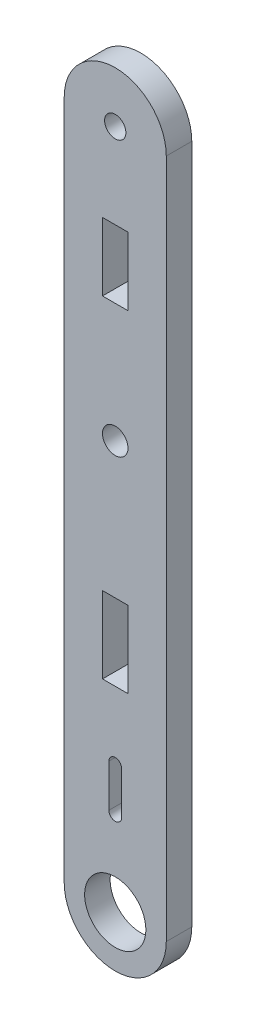
ISO-10303-21;
HEADER;
FILE_DESCRIPTION(('STEP AP214'),'2;1');
FILE_NAME('part.step','',(''),(''),'','','');
FILE_SCHEMA(('AUTOMOTIVE_DESIGN { 1 0 10303 214 1 1 1 1 }'));
ENDSEC;
DATA;
#1=APPLICATION_CONTEXT('core data for automotive mechanical design processes');
#2=APPLICATION_PROTOCOL_DEFINITION('international standard','automotive_design',2000,#1);
#3=PRODUCT_CONTEXT('',#1,'mechanical');
#4=PRODUCT('Part','Part','',(#3));
#5=PRODUCT_RELATED_PRODUCT_CATEGORY('part','',(#4));
#6=PRODUCT_DEFINITION_FORMATION('','',#4);
#7=PRODUCT_DEFINITION_CONTEXT('part definition',#1,'design');
#8=PRODUCT_DEFINITION('design','',#6,#7);
#9=PRODUCT_DEFINITION_SHAPE('','',#8);
#10=(LENGTH_UNIT() NAMED_UNIT(*) SI_UNIT(.MILLI.,.METRE.));
#11=(NAMED_UNIT(*) PLANE_ANGLE_UNIT() SI_UNIT($,.RADIAN.));
#12=(NAMED_UNIT(*) SI_UNIT($,.STERADIAN.) SOLID_ANGLE_UNIT());
#13=UNCERTAINTY_MEASURE_WITH_UNIT(LENGTH_MEASURE(1.E-05),#10,'distance_accuracy_value','');
#14=(GEOMETRIC_REPRESENTATION_CONTEXT(3) GLOBAL_UNCERTAINTY_ASSIGNED_CONTEXT((#13)) GLOBAL_UNIT_ASSIGNED_CONTEXT((#10,
#11,#12)) REPRESENTATION_CONTEXT('',''));
#15=CARTESIAN_POINT('',(0.,0.,0.));
#16=DIRECTION('',(0.,0.,1.));
#17=DIRECTION('',(1.,0.,0.));
#18=AXIS2_PLACEMENT_3D('',#15,#16,#17);
#19=CARTESIAN_POINT('',(6.30029999933328,8.2998760434166,3.));
#20=DIRECTION('',(0.,0.,1.));
#21=DIRECTION('',(1.,0.,0.));
#22=AXIS2_PLACEMENT_3D('',#19,#20,#21);
#23=PLANE('',#22);
#24=CARTESIAN_POINT('',(6.30030000166648,56.2999760424166,3.));
#25=DIRECTION('',(0.,0.,1.));
#26=DIRECTION('',(1.,0.,0.));
#27=AXIS2_PLACEMENT_3D('',#24,#25,#26);
#28=CIRCLE('',#27,1.50000000166676);
#29=CARTESIAN_POINT('',(7.80030000333324,56.2999760424166,3.));
#30=VERTEX_POINT('',#29);
#31=EDGE_CURVE('E219',#30,#30,#28,.T.);
#32=ORIENTED_EDGE('',*,*,#31,.F.);
#33=EDGE_LOOP('',(#32));
#34=FACE_BOUND('',#33,.T.);
#35=CARTESIAN_POINT('',(6.30029999933328,8.2998760434166,3.));
#36=DIRECTION('',(0.,0.,1.));
#37=DIRECTION('',(1.,0.,0.));
#38=AXIS2_PLACEMENT_3D('',#35,#36,#37);
#39=CIRCLE('',#38,5.99999999999991);
#40=CARTESIAN_POINT('',(0.300300000000173,8.29987604406612,3.));
#41=VERTEX_POINT('',#40);
#42=CARTESIAN_POINT('',(12.3003,8.29987604400681,3.));
#43=VERTEX_POINT('',#42);
#44=EDGE_CURVE('E262',#41,#43,#39,.T.);
#45=ORIENTED_EDGE('',*,*,#44,.T.);
#46=DIRECTION('',(0.,1.,0.));
#47=VECTOR('',#46,1.);
#48=CARTESIAN_POINT('',(12.3003,8.29987604400681,3.));
#49=LINE('',#48,#47);
#50=CARTESIAN_POINT('',(12.3003,88.2998760437166,3.));
#51=VERTEX_POINT('',#50);
#52=EDGE_CURVE('E265',#43,#51,#49,.T.);
#53=ORIENTED_EDGE('',*,*,#52,.T.);
#54=CARTESIAN_POINT('',(6.30030000000003,88.2999260438786,3.));
#55=DIRECTION('',(0.,0.,1.));
#56=DIRECTION('',(-1.,0.,0.));
#57=AXIS2_PLACEMENT_3D('',#54,#55,#56);
#58=CIRCLE('',#57,6.00000000020827);
#59=CARTESIAN_POINT('',(0.300300000000128,88.2999760440405,3.));
#60=VERTEX_POINT('',#59);
#61=EDGE_CURVE('E268',#51,#60,#58,.T.);
#62=ORIENTED_EDGE('',*,*,#61,.T.);
#63=DIRECTION('',(0.,-1.,0.));
#64=VECTOR('',#63,1.);
#65=CARTESIAN_POINT('',(0.300300000000128,88.2999760440405,3.));
#66=LINE('',#65,#64);
#67=EDGE_CURVE('E270',#60,#41,#66,.T.);
#68=ORIENTED_EDGE('',*,*,#67,.T.);
#69=EDGE_LOOP('',(#45,#53,#62,#68));
#70=FACE_BOUND('',#69,.T.);
#71=CARTESIAN_POINT('',(6.30029999933328,8.2998760434166,3.));
#72=DIRECTION('',(0.,0.,1.));
#73=DIRECTION('',(1.,0.,0.));
#74=AXIS2_PLACEMENT_3D('',#71,#72,#73);
#75=CIRCLE('',#74,3.6);
#76=CARTESIAN_POINT('',(9.90029999933328,8.2998760434166,3.));
#77=VERTEX_POINT('',#76);
#78=EDGE_CURVE('E256',#77,#77,#75,.T.);
#79=ORIENTED_EDGE('',*,*,#78,.F.);
#80=EDGE_LOOP('',(#79));
#81=FACE_BOUND('',#80,.T.);
#82=DIRECTION('',(0.,1.,0.));
#83=VECTOR('',#82,1.);
#84=CARTESIAN_POINT('',(7.05029999722208,18.29987985471,3.));
#85=LINE('',#84,#83);
#86=CARTESIAN_POINT('',(7.05029999722208,18.29987985471,3.));
#87=VERTEX_POINT('',#86);
#88=CARTESIAN_POINT('',(7.05029999595412,23.299876041305,3.));
#89=VERTEX_POINT('',#88);
#90=EDGE_CURVE('E227',#87,#89,#85,.T.);
#91=ORIENTED_EDGE('',*,*,#90,.F.);
#92=CARTESIAN_POINT('',(6.30030000000001,18.29987985471,3.));
#93=DIRECTION('',(0.,0.,1.));
#94=DIRECTION('',(1.,0.,0.));
#95=AXIS2_PLACEMENT_3D('',#92,#93,#94);
#96=CIRCLE('',#95,0.74999999722207);
#97=CARTESIAN_POINT('',(5.55030000277794,18.29987985471,3.));
#98=VERTEX_POINT('',#97);
#99=EDGE_CURVE('E225',#98,#87,#96,.T.);
#100=ORIENTED_EDGE('',*,*,#99,.F.);
#101=DIRECTION('',(0.,-1.,0.));
#102=VECTOR('',#101,1.);
#103=CARTESIAN_POINT('',(5.55030000277794,18.29987985471,3.));
#104=LINE('',#103,#102);
#105=CARTESIAN_POINT('',(5.55030000277794,23.2998760413049,3.));
#106=VERTEX_POINT('',#105);
#107=EDGE_CURVE('E233',#106,#98,#104,.T.);
#108=ORIENTED_EDGE('',*,*,#107,.F.);
#109=CARTESIAN_POINT('',(6.30029999873205,23.2999177091288,3.));
#110=DIRECTION('',(0.,0.,1.));
#111=DIRECTION('',(1.,0.,0.));
#112=AXIS2_PLACEMENT_3D('',#109,#110,#111);
#113=CIRCLE('',#112,0.749999998379542);
#114=EDGE_CURVE('E230',#89,#106,#113,.T.);
#115=ORIENTED_EDGE('',*,*,#114,.F.);
#116=EDGE_LOOP('',(#91,#100,#108,#115));
#117=FACE_BOUND('',#116,.T.);
#118=CARTESIAN_POINT('',(6.30029999807681,88.2998760421602,3.));
#119=DIRECTION('',(0.,0.,1.));
#120=DIRECTION('',(1.,0.,0.));
#121=AXIS2_PLACEMENT_3D('',#118,#119,#120);
#122=CIRCLE('',#121,1.25);
#123=CARTESIAN_POINT('',(7.55029999807681,88.2998760421602,3.));
#124=VERTEX_POINT('',#123);
#125=EDGE_CURVE('E213',#124,#124,#122,.T.);
#126=ORIENTED_EDGE('',*,*,#125,.F.);
#127=EDGE_LOOP('',(#126));
#128=FACE_BOUND('',#127,.T.);
#129=DIRECTION('',(1.,0.,0.));
#130=VECTOR('',#129,1.);
#131=CARTESIAN_POINT('',(4.8003,70.2998760440833,3.));
#132=LINE('',#131,#130);
#133=CARTESIAN_POINT('',(4.8003,70.2998760440833,3.));
#134=VERTEX_POINT('',#133);
#135=CARTESIAN_POINT('',(7.8003,70.2998760440833,3.));
#136=VERTEX_POINT('',#135);
#137=EDGE_CURVE('E184',#134,#136,#132,.T.);
#138=ORIENTED_EDGE('',*,*,#137,.F.);
#139=DIRECTION('',(0.,-1.,0.));
#140=VECTOR('',#139,1.);
#141=CARTESIAN_POINT('',(4.8003,78.2998760440833,3.));
#142=LINE('',#141,#140);
#143=CARTESIAN_POINT('',(4.8003,78.2998760440833,3.));
#144=VERTEX_POINT('',#143);
#145=EDGE_CURVE('E182',#144,#134,#142,.T.);
#146=ORIENTED_EDGE('',*,*,#145,.F.);
#147=DIRECTION('',(-1.,0.,0.));
#148=VECTOR('',#147,1.);
#149=CARTESIAN_POINT('',(4.8003,78.2998760440833,3.));
#150=LINE('',#149,#148);
#151=CARTESIAN_POINT('',(7.8003,78.2998760440833,3.));
#152=VERTEX_POINT('',#151);
#153=EDGE_CURVE('E190',#152,#144,#150,.T.);
#154=ORIENTED_EDGE('',*,*,#153,.F.);
#155=DIRECTION('',(0.,1.,0.));
#156=VECTOR('',#155,1.);
#157=CARTESIAN_POINT('',(7.8003,78.2998760440833,3.));
#158=LINE('',#157,#156);
#159=EDGE_CURVE('E187',#136,#152,#158,.T.);
#160=ORIENTED_EDGE('',*,*,#159,.F.);
#161=EDGE_LOOP('',(#138,#146,#154,#160));
#162=FACE_BOUND('',#161,.T.);
#163=DIRECTION('',(-1.,0.,0.));
#164=VECTOR('',#163,1.);
#165=CARTESIAN_POINT('',(7.8003,40.2998760440833,3.));
#166=LINE('',#165,#164);
#167=CARTESIAN_POINT('',(7.8003,40.2998760440833,3.));
#168=VERTEX_POINT('',#167);
#169=CARTESIAN_POINT('',(4.8003,40.2998760440833,3.));
#170=VERTEX_POINT('',#169);
#171=EDGE_CURVE('E154',#168,#170,#166,.T.);
#172=ORIENTED_EDGE('',*,*,#171,.F.);
#173=DIRECTION('',(0.,1.,0.));
#174=VECTOR('',#173,1.);
#175=CARTESIAN_POINT('',(7.8003,31.2998760440833,3.));
#176=LINE('',#175,#174);
#177=CARTESIAN_POINT('',(7.8003,31.2998760440833,3.));
#178=VERTEX_POINT('',#177);
#179=EDGE_CURVE('E146',#178,#168,#176,.T.);
#180=ORIENTED_EDGE('',*,*,#179,.F.);
#181=DIRECTION('',(1.,0.,0.));
#182=VECTOR('',#181,1.);
#183=CARTESIAN_POINT('',(7.8003,31.2998760440833,3.));
#184=LINE('',#183,#182);
#185=CARTESIAN_POINT('',(4.8003,31.2998760440833,3.));
#186=VERTEX_POINT('',#185);
#187=EDGE_CURVE('E168',#186,#178,#184,.T.);
#188=ORIENTED_EDGE('',*,*,#187,.F.);
#189=DIRECTION('',(0.,-1.,0.));
#190=VECTOR('',#189,1.);
#191=CARTESIAN_POINT('',(4.8003,31.2998760440833,3.));
#192=LINE('',#191,#190);
#193=EDGE_CURVE('E166',#170,#186,#192,.T.);
#194=ORIENTED_EDGE('',*,*,#193,.F.);
#195=EDGE_LOOP('',(#172,#180,#188,#194));
#196=FACE_BOUND('',#195,.T.);
#197=ADVANCED_FACE('F33',(#34,#70,#81,#117,#128,#162,#196),#23,.T.);
#198=CARTESIAN_POINT('',(6.30029999933328,8.2998760434166,0.));
#199=DIRECTION('',(0.,0.,1.));
#200=DIRECTION('',(1.,0.,0.));
#201=AXIS2_PLACEMENT_3D('',#198,#199,#200);
#202=PLANE('',#201);
#203=DIRECTION('',(0.,-1.,0.));
#204=VECTOR('',#203,1.);
#205=CARTESIAN_POINT('',(4.8003,78.2998760440833,0.));
#206=LINE('',#205,#204);
#207=CARTESIAN_POINT('',(4.8003,78.2998760440833,0.));
#208=VERTEX_POINT('',#207);
#209=CARTESIAN_POINT('',(4.8003,70.2998760440833,0.));
#210=VERTEX_POINT('',#209);
#211=EDGE_CURVE('E162',#208,#210,#206,.T.);
#212=ORIENTED_EDGE('',*,*,#211,.T.);
#213=DIRECTION('',(1.,0.,0.));
#214=VECTOR('',#213,1.);
#215=CARTESIAN_POINT('',(4.8003,70.2998760440833,0.));
#216=LINE('',#215,#214);
#217=CARTESIAN_POINT('',(7.8003,70.2998760440833,0.));
#218=VERTEX_POINT('',#217);
#219=EDGE_CURVE('E195',#210,#218,#216,.T.);
#220=ORIENTED_EDGE('',*,*,#219,.T.);
#221=DIRECTION('',(0.,1.,0.));
#222=VECTOR('',#221,1.);
#223=CARTESIAN_POINT('',(7.8003,78.2998760440833,0.));
#224=LINE('',#223,#222);
#225=CARTESIAN_POINT('',(7.8003,78.2998760440833,0.));
#226=VERTEX_POINT('',#225);
#227=EDGE_CURVE('E198',#218,#226,#224,.T.);
#228=ORIENTED_EDGE('',*,*,#227,.T.);
#229=DIRECTION('',(-1.,0.,0.));
#230=VECTOR('',#229,1.);
#231=CARTESIAN_POINT('',(4.8003,78.2998760440833,0.));
#232=LINE('',#231,#230);
#233=EDGE_CURVE('E185',#226,#208,#232,.T.);
#234=ORIENTED_EDGE('',*,*,#233,.T.);
#235=EDGE_LOOP('',(#212,#220,#228,#234));
#236=FACE_BOUND('',#235,.T.);
#237=CARTESIAN_POINT('',(6.30029999933328,8.2998760434166,0.));
#238=DIRECTION('',(0.,0.,1.));
#239=DIRECTION('',(1.,0.,0.));
#240=AXIS2_PLACEMENT_3D('',#237,#238,#239);
#241=CIRCLE('',#240,3.6);
#242=CARTESIAN_POINT('',(9.90029999933328,8.2998760434166,0.));
#243=VERTEX_POINT('',#242);
#244=EDGE_CURVE('E255',#243,#243,#241,.T.);
#245=ORIENTED_EDGE('',*,*,#244,.T.);
#246=EDGE_LOOP('',(#245));
#247=FACE_BOUND('',#246,.T.);
#248=CARTESIAN_POINT('',(6.30029999933328,8.2998760434166,0.));
#249=DIRECTION('',(0.,0.,1.));
#250=DIRECTION('',(1.,0.,0.));
#251=AXIS2_PLACEMENT_3D('',#248,#249,#250);
#252=CIRCLE('',#251,5.99999999999991);
#253=CARTESIAN_POINT('',(0.300300000000173,8.29987604406612,0.));
#254=VERTEX_POINT('',#253);
#255=CARTESIAN_POINT('',(12.3003,8.29987604400681,0.));
#256=VERTEX_POINT('',#255);
#257=EDGE_CURVE('E259',#254,#256,#252,.T.);
#258=ORIENTED_EDGE('',*,*,#257,.F.);
#259=DIRECTION('',(0.,-1.,0.));
#260=VECTOR('',#259,1.);
#261=CARTESIAN_POINT('',(0.300300000000128,88.2999760440405,0.));
#262=LINE('',#261,#260);
#263=CARTESIAN_POINT('',(0.300300000000128,88.2999760440405,0.));
#264=VERTEX_POINT('',#263);
#265=EDGE_CURVE('E266',#264,#254,#262,.T.);
#266=ORIENTED_EDGE('',*,*,#265,.F.);
#267=CARTESIAN_POINT('',(6.30030000000003,88.2999260438786,0.));
#268=DIRECTION('',(0.,0.,1.));
#269=DIRECTION('',(-1.,0.,0.));
#270=AXIS2_PLACEMENT_3D('',#267,#268,#269);
#271=CIRCLE('',#270,6.00000000020827);
#272=CARTESIAN_POINT('',(12.3003,88.2998760437166,0.));
#273=VERTEX_POINT('',#272);
#274=EDGE_CURVE('E277',#273,#264,#271,.T.);
#275=ORIENTED_EDGE('',*,*,#274,.F.);
#276=DIRECTION('',(0.,1.,0.));
#277=VECTOR('',#276,1.);
#278=CARTESIAN_POINT('',(12.3003,8.29987604400681,0.));
#279=LINE('',#278,#277);
#280=EDGE_CURVE('E275',#256,#273,#279,.T.);
#281=ORIENTED_EDGE('',*,*,#280,.F.);
#282=EDGE_LOOP('',(#258,#266,#275,#281));
#283=FACE_BOUND('',#282,.T.);
#284=CARTESIAN_POINT('',(6.30030000000001,18.29987985471,0.));
#285=DIRECTION('',(0.,0.,1.));
#286=DIRECTION('',(1.,0.,0.));
#287=AXIS2_PLACEMENT_3D('',#284,#285,#286);
#288=CIRCLE('',#287,0.74999999722207);
#289=CARTESIAN_POINT('',(5.55030000277794,18.29987985471,0.));
#290=VERTEX_POINT('',#289);
#291=CARTESIAN_POINT('',(7.05029999722208,18.29987985471,0.));
#292=VERTEX_POINT('',#291);
#293=EDGE_CURVE('E222',#290,#292,#288,.T.);
#294=ORIENTED_EDGE('',*,*,#293,.T.);
#295=DIRECTION('',(0.,1.,0.));
#296=VECTOR('',#295,1.);
#297=CARTESIAN_POINT('',(7.05029999722208,18.29987985471,0.));
#298=LINE('',#297,#296);
#299=CARTESIAN_POINT('',(7.05029999595412,23.299876041305,0.));
#300=VERTEX_POINT('',#299);
#301=EDGE_CURVE('E238',#292,#300,#298,.T.);
#302=ORIENTED_EDGE('',*,*,#301,.T.);
#303=CARTESIAN_POINT('',(6.30029999873205,23.2999177091288,0.));
#304=DIRECTION('',(0.,0.,1.));
#305=DIRECTION('',(1.,0.,0.));
#306=AXIS2_PLACEMENT_3D('',#303,#304,#305);
#307=CIRCLE('',#306,0.749999998379542);
#308=CARTESIAN_POINT('',(5.55030000277794,23.2998760413049,0.));
#309=VERTEX_POINT('',#308);
#310=EDGE_CURVE('E241',#300,#309,#307,.T.);
#311=ORIENTED_EDGE('',*,*,#310,.T.);
#312=DIRECTION('',(0.,-1.,0.));
#313=VECTOR('',#312,1.);
#314=CARTESIAN_POINT('',(5.55030000277794,18.29987985471,0.));
#315=LINE('',#314,#313);
#316=EDGE_CURVE('E228',#309,#290,#315,.T.);
#317=ORIENTED_EDGE('',*,*,#316,.T.);
#318=EDGE_LOOP('',(#294,#302,#311,#317));
#319=FACE_BOUND('',#318,.T.);
#320=CARTESIAN_POINT('',(6.30030000166648,56.2999760424166,0.));
#321=DIRECTION('',(0.,0.,1.));
#322=DIRECTION('',(1.,0.,0.));
#323=AXIS2_PLACEMENT_3D('',#320,#321,#322);
#324=CIRCLE('',#323,1.50000000166676);
#325=CARTESIAN_POINT('',(7.80030000333324,56.2999760424166,0.));
#326=VERTEX_POINT('',#325);
#327=EDGE_CURVE('E216',#326,#326,#324,.T.);
#328=ORIENTED_EDGE('',*,*,#327,.T.);
#329=EDGE_LOOP('',(#328));
#330=FACE_BOUND('',#329,.T.);
#331=CARTESIAN_POINT('',(6.30029999807681,88.2998760421602,0.));
#332=DIRECTION('',(0.,0.,1.));
#333=DIRECTION('',(1.,0.,0.));
#334=AXIS2_PLACEMENT_3D('',#331,#332,#333);
#335=CIRCLE('',#334,1.25);
#336=CARTESIAN_POINT('',(7.55029999807681,88.2998760421602,0.));
#337=VERTEX_POINT('',#336);
#338=EDGE_CURVE('E212',#337,#337,#335,.T.);
#339=ORIENTED_EDGE('',*,*,#338,.T.);
#340=EDGE_LOOP('',(#339));
#341=FACE_BOUND('',#340,.T.);
#342=DIRECTION('',(0.,1.,0.));
#343=VECTOR('',#342,1.);
#344=CARTESIAN_POINT('',(7.8003,31.2998760440833,0.));
#345=LINE('',#344,#343);
#346=CARTESIAN_POINT('',(7.8003,31.2998760440833,0.));
#347=VERTEX_POINT('',#346);
#348=CARTESIAN_POINT('',(7.8003,40.2998760440833,0.));
#349=VERTEX_POINT('',#348);
#350=EDGE_CURVE('E56',#347,#349,#345,.T.);
#351=ORIENTED_EDGE('',*,*,#350,.T.);
#352=DIRECTION('',(-1.,0.,0.));
#353=VECTOR('',#352,1.);
#354=CARTESIAN_POINT('',(7.8003,40.2998760440833,0.));
#355=LINE('',#354,#353);
#356=CARTESIAN_POINT('',(4.8003,40.2998760440833,0.));
#357=VERTEX_POINT('',#356);
#358=EDGE_CURVE('E161',#349,#357,#355,.T.);
#359=ORIENTED_EDGE('',*,*,#358,.T.);
#360=DIRECTION('',(0.,-1.,0.));
#361=VECTOR('',#360,1.);
#362=CARTESIAN_POINT('',(4.8003,31.2998760440833,0.));
#363=LINE('',#362,#361);
#364=CARTESIAN_POINT('',(4.8003,31.2998760440833,0.));
#365=VERTEX_POINT('',#364);
#366=EDGE_CURVE('E174',#357,#365,#363,.T.);
#367=ORIENTED_EDGE('',*,*,#366,.T.);
#368=DIRECTION('',(1.,0.,0.));
#369=VECTOR('',#368,1.);
#370=CARTESIAN_POINT('',(7.8003,31.2998760440833,0.));
#371=LINE('',#370,#369);
#372=EDGE_CURVE('E155',#365,#347,#371,.T.);
#373=ORIENTED_EDGE('',*,*,#372,.T.);
#374=EDGE_LOOP('',(#351,#359,#367,#373));
#375=FACE_BOUND('',#374,.T.);
#376=ADVANCED_FACE('F295',(#236,#247,#283,#319,#330,#341,#375),#202,.F.);
#377=CARTESIAN_POINT('',(6.30029999933328,8.2998760434166,3.));
#378=DIRECTION('',(0.,0.,-1.));
#379=DIRECTION('',(-1.,0.,0.));
#380=AXIS2_PLACEMENT_3D('',#377,#378,#379);
#381=CYLINDRICAL_SURFACE('',#380,5.99999999999991);
#382=ORIENTED_EDGE('',*,*,#257,.T.);
#383=DIRECTION('',(0.,0.,-1.));
#384=VECTOR('',#383,1.);
#385=CARTESIAN_POINT('',(12.3003,8.29987604400681,3.));
#386=LINE('',#385,#384);
#387=EDGE_CURVE('E11',#43,#256,#386,.T.);
#388=ORIENTED_EDGE('',*,*,#387,.F.);
#389=ORIENTED_EDGE('',*,*,#44,.F.);
#390=DIRECTION('',(0.,0.,-1.));
#391=VECTOR('',#390,1.);
#392=CARTESIAN_POINT('',(0.300300000000173,8.29987604406612,3.));
#393=LINE('',#392,#391);
#394=EDGE_CURVE('E272',#41,#254,#393,.T.);
#395=ORIENTED_EDGE('',*,*,#394,.T.);
#396=EDGE_LOOP('',(#382,#388,#389,#395));
#397=FACE_BOUND('',#396,.T.);
#398=ADVANCED_FACE('F35',(#397),#381,.T.);
#399=CARTESIAN_POINT('',(12.3003,8.29987604400681,3.));
#400=DIRECTION('',(-1.,0.,0.));
#401=DIRECTION('',(0.,-1.,0.));
#402=AXIS2_PLACEMENT_3D('',#399,#400,#401);
#403=PLANE('',#402);
#404=ORIENTED_EDGE('',*,*,#280,.T.);
#405=DIRECTION('',(0.,0.,-1.));
#406=VECTOR('',#405,1.);
#407=CARTESIAN_POINT('',(12.3003,88.2998760437166,3.));
#408=LINE('',#407,#406);
#409=EDGE_CURVE('E41',#51,#273,#408,.T.);
#410=ORIENTED_EDGE('',*,*,#409,.F.);
#411=ORIENTED_EDGE('',*,*,#52,.F.);
#412=ORIENTED_EDGE('',*,*,#387,.T.);
#413=EDGE_LOOP('',(#404,#410,#411,#412));
#414=FACE_BOUND('',#413,.T.);
#415=ADVANCED_FACE('F306',(#414),#403,.F.);
#416=CARTESIAN_POINT('',(6.30030000000003,88.2999260438786,3.));
#417=DIRECTION('',(0.,0.,-1.));
#418=DIRECTION('',(-1.,0.,0.));
#419=AXIS2_PLACEMENT_3D('',#416,#417,#418);
#420=CYLINDRICAL_SURFACE('',#419,6.00000000020827);
#421=ORIENTED_EDGE('',*,*,#274,.T.);
#422=DIRECTION('',(0.,0.,-1.));
#423=VECTOR('',#422,1.);
#424=CARTESIAN_POINT('',(0.300300000000128,88.2999760440405,3.));
#425=LINE('',#424,#423);
#426=EDGE_CURVE('E282',#60,#264,#425,.T.);
#427=ORIENTED_EDGE('',*,*,#426,.F.);
#428=ORIENTED_EDGE('',*,*,#61,.F.);
#429=ORIENTED_EDGE('',*,*,#409,.T.);
#430=EDGE_LOOP('',(#421,#427,#428,#429));
#431=FACE_BOUND('',#430,.T.);
#432=ADVANCED_FACE('F289',(#431),#420,.T.);
#433=CARTESIAN_POINT('',(0.300300000000128,88.2999760440405,3.));
#434=DIRECTION('',(1.,0.,0.));
#435=DIRECTION('',(0.,1.,0.));
#436=AXIS2_PLACEMENT_3D('',#433,#434,#435);
#437=PLANE('',#436);
#438=ORIENTED_EDGE('',*,*,#265,.T.);
#439=ORIENTED_EDGE('',*,*,#394,.F.);
#440=ORIENTED_EDGE('',*,*,#67,.F.);
#441=ORIENTED_EDGE('',*,*,#426,.T.);
#442=EDGE_LOOP('',(#438,#439,#440,#441));
#443=FACE_BOUND('',#442,.T.);
#444=ADVANCED_FACE('F299',(#443),#437,.F.);
#445=CARTESIAN_POINT('',(6.30029999933328,8.2998760434166,3.));
#446=DIRECTION('',(0.,0.,-1.));
#447=DIRECTION('',(-1.,0.,0.));
#448=AXIS2_PLACEMENT_3D('',#445,#446,#447);
#449=CYLINDRICAL_SURFACE('',#448,3.6);
#450=ORIENTED_EDGE('',*,*,#78,.T.);
#451=EDGE_LOOP('',(#450));
#452=FACE_BOUND('',#451,.T.);
#453=ORIENTED_EDGE('',*,*,#244,.F.);
#454=EDGE_LOOP('',(#453));
#455=FACE_BOUND('',#454,.T.);
#456=ADVANCED_FACE('F323',(#452,#455),#449,.F.);
#457=CARTESIAN_POINT('',(6.30030000000001,18.29987985471,3.));
#458=DIRECTION('',(0.,0.,-1.));
#459=DIRECTION('',(-1.,0.,0.));
#460=AXIS2_PLACEMENT_3D('',#457,#458,#459);
#461=CYLINDRICAL_SURFACE('',#460,0.74999999722207);
#462=ORIENTED_EDGE('',*,*,#293,.F.);
#463=DIRECTION('',(0.,0.,-1.));
#464=VECTOR('',#463,1.);
#465=CARTESIAN_POINT('',(5.55030000277794,18.29987985471,3.));
#466=LINE('',#465,#464);
#467=EDGE_CURVE('E235',#98,#290,#466,.T.);
#468=ORIENTED_EDGE('',*,*,#467,.F.);
#469=ORIENTED_EDGE('',*,*,#99,.T.);
#470=DIRECTION('',(0.,0.,-1.));
#471=VECTOR('',#470,1.);
#472=CARTESIAN_POINT('',(7.05029999722208,18.29987985471,3.));
#473=LINE('',#472,#471);
#474=EDGE_CURVE('E252',#87,#292,#473,.T.);
#475=ORIENTED_EDGE('',*,*,#474,.T.);
#476=EDGE_LOOP('',(#462,#468,#469,#475));
#477=FACE_BOUND('',#476,.T.);
#478=ADVANCED_FACE('F330',(#477),#461,.F.);
#479=CARTESIAN_POINT('',(7.05029999722208,18.29987985471,3.));
#480=DIRECTION('',(-1.,0.,0.));
#481=DIRECTION('',(0.,0.,1.));
#482=AXIS2_PLACEMENT_3D('',#479,#480,#481);
#483=PLANE('',#482);
#484=ORIENTED_EDGE('',*,*,#301,.F.);
#485=ORIENTED_EDGE('',*,*,#474,.F.);
#486=ORIENTED_EDGE('',*,*,#90,.T.);
#487=DIRECTION('',(0.,0.,-1.));
#488=VECTOR('',#487,1.);
#489=CARTESIAN_POINT('',(7.05029999595412,23.299876041305,3.));
#490=LINE('',#489,#488);
#491=EDGE_CURVE('E250',#89,#300,#490,.T.);
#492=ORIENTED_EDGE('',*,*,#491,.T.);
#493=EDGE_LOOP('',(#484,#485,#486,#492));
#494=FACE_BOUND('',#493,.T.);
#495=ADVANCED_FACE('F335',(#494),#483,.T.);
#496=CARTESIAN_POINT('',(6.30029999873205,23.2999177091288,3.));
#497=DIRECTION('',(0.,0.,-1.));
#498=DIRECTION('',(-1.,0.,0.));
#499=AXIS2_PLACEMENT_3D('',#496,#497,#498);
#500=CYLINDRICAL_SURFACE('',#499,0.749999998379542);
#501=ORIENTED_EDGE('',*,*,#310,.F.);
#502=ORIENTED_EDGE('',*,*,#491,.F.);
#503=ORIENTED_EDGE('',*,*,#114,.T.);
#504=DIRECTION('',(0.,0.,-1.));
#505=VECTOR('',#504,1.);
#506=CARTESIAN_POINT('',(5.55030000277794,23.2998760413049,3.));
#507=LINE('',#506,#505);
#508=EDGE_CURVE('E248',#106,#309,#507,.T.);
#509=ORIENTED_EDGE('',*,*,#508,.T.);
#510=EDGE_LOOP('',(#501,#502,#503,#509));
#511=FACE_BOUND('',#510,.T.);
#512=ADVANCED_FACE('F390',(#511),#500,.F.);
#513=CARTESIAN_POINT('',(5.55030000277794,18.29987985471,3.));
#514=DIRECTION('',(1.,0.,0.));
#515=DIRECTION('',(0.,0.,-1.));
#516=AXIS2_PLACEMENT_3D('',#513,#514,#515);
#517=PLANE('',#516);
#518=ORIENTED_EDGE('',*,*,#316,.F.);
#519=ORIENTED_EDGE('',*,*,#508,.F.);
#520=ORIENTED_EDGE('',*,*,#107,.T.);
#521=ORIENTED_EDGE('',*,*,#467,.T.);
#522=EDGE_LOOP('',(#518,#519,#520,#521));
#523=FACE_BOUND('',#522,.T.);
#524=ADVANCED_FACE('F386',(#523),#517,.T.);
#525=CARTESIAN_POINT('',(6.30030000166648,56.2999760424166,3.));
#526=DIRECTION('',(0.,0.,-1.));
#527=DIRECTION('',(-1.,0.,0.));
#528=AXIS2_PLACEMENT_3D('',#525,#526,#527);
#529=CYLINDRICAL_SURFACE('',#528,1.50000000166676);
#530=ORIENTED_EDGE('',*,*,#31,.T.);
#531=EDGE_LOOP('',(#530));
#532=FACE_BOUND('',#531,.T.);
#533=ORIENTED_EDGE('',*,*,#327,.F.);
#534=EDGE_LOOP('',(#533));
#535=FACE_BOUND('',#534,.T.);
#536=ADVANCED_FACE('F382',(#532,#535),#529,.F.);
#537=CARTESIAN_POINT('',(6.30029999807681,88.2998760421602,3.));
#538=DIRECTION('',(0.,0.,-1.));
#539=DIRECTION('',(-1.,0.,0.));
#540=AXIS2_PLACEMENT_3D('',#537,#538,#539);
#541=CYLINDRICAL_SURFACE('',#540,1.25);
#542=ORIENTED_EDGE('',*,*,#125,.T.);
#543=EDGE_LOOP('',(#542));
#544=FACE_BOUND('',#543,.T.);
#545=ORIENTED_EDGE('',*,*,#338,.F.);
#546=EDGE_LOOP('',(#545));
#547=FACE_BOUND('',#546,.T.);
#548=ADVANCED_FACE('F379',(#544,#547),#541,.F.);
#549=CARTESIAN_POINT('',(4.8003,78.2998760440833,3.));
#550=DIRECTION('',(1.,0.,0.));
#551=DIRECTION('',(0.,0.,-1.));
#552=AXIS2_PLACEMENT_3D('',#549,#550,#551);
#553=PLANE('',#552);
#554=ORIENTED_EDGE('',*,*,#211,.F.);
#555=DIRECTION('',(0.,0.,-1.));
#556=VECTOR('',#555,1.);
#557=CARTESIAN_POINT('',(4.8003,78.2998760440833,3.));
#558=LINE('',#557,#556);
#559=EDGE_CURVE('E192',#144,#208,#558,.T.);
#560=ORIENTED_EDGE('',*,*,#559,.F.);
#561=ORIENTED_EDGE('',*,*,#145,.T.);
#562=DIRECTION('',(0.,0.,-1.));
#563=VECTOR('',#562,1.);
#564=CARTESIAN_POINT('',(4.8003,70.2998760440833,3.));
#565=LINE('',#564,#563);
#566=EDGE_CURVE('E209',#134,#210,#565,.T.);
#567=ORIENTED_EDGE('',*,*,#566,.T.);
#568=EDGE_LOOP('',(#554,#560,#561,#567));
#569=FACE_BOUND('',#568,.T.);
#570=ADVANCED_FACE('F361',(#569),#553,.T.);
#571=CARTESIAN_POINT('',(4.8003,70.2998760440833,3.));
#572=DIRECTION('',(0.,1.,0.));
#573=DIRECTION('',(0.,0.,1.));
#574=AXIS2_PLACEMENT_3D('',#571,#572,#573);
#575=PLANE('',#574);
#576=ORIENTED_EDGE('',*,*,#219,.F.);
#577=ORIENTED_EDGE('',*,*,#566,.F.);
#578=ORIENTED_EDGE('',*,*,#137,.T.);
#579=DIRECTION('',(0.,0.,-1.));
#580=VECTOR('',#579,1.);
#581=CARTESIAN_POINT('',(7.8003,70.2998760440833,3.));
#582=LINE('',#581,#580);
#583=EDGE_CURVE('E207',#136,#218,#582,.T.);
#584=ORIENTED_EDGE('',*,*,#583,.T.);
#585=EDGE_LOOP('',(#576,#577,#578,#584));
#586=FACE_BOUND('',#585,.T.);
#587=ADVANCED_FACE('F355',(#586),#575,.T.);
#588=CARTESIAN_POINT('',(7.8003,78.2998760440833,3.));
#589=DIRECTION('',(-1.,0.,0.));
#590=DIRECTION('',(0.,0.,1.));
#591=AXIS2_PLACEMENT_3D('',#588,#589,#590);
#592=PLANE('',#591);
#593=ORIENTED_EDGE('',*,*,#227,.F.);
#594=ORIENTED_EDGE('',*,*,#583,.F.);
#595=ORIENTED_EDGE('',*,*,#159,.T.);
#596=DIRECTION('',(0.,0.,-1.));
#597=VECTOR('',#596,1.);
#598=CARTESIAN_POINT('',(7.8003,78.2998760440833,3.));
#599=LINE('',#598,#597);
#600=EDGE_CURVE('E205',#152,#226,#599,.T.);
#601=ORIENTED_EDGE('',*,*,#600,.T.);
#602=EDGE_LOOP('',(#593,#594,#595,#601));
#603=FACE_BOUND('',#602,.T.);
#604=ADVANCED_FACE('F358',(#603),#592,.T.);
#605=CARTESIAN_POINT('',(4.8003,78.2998760440833,3.));
#606=DIRECTION('',(0.,-1.,0.));
#607=DIRECTION('',(0.,0.,-1.));
#608=AXIS2_PLACEMENT_3D('',#605,#606,#607);
#609=PLANE('',#608);
#610=ORIENTED_EDGE('',*,*,#233,.F.);
#611=ORIENTED_EDGE('',*,*,#600,.F.);
#612=ORIENTED_EDGE('',*,*,#153,.T.);
#613=ORIENTED_EDGE('',*,*,#559,.T.);
#614=EDGE_LOOP('',(#610,#611,#612,#613));
#615=FACE_BOUND('',#614,.T.);
#616=ADVANCED_FACE('F364',(#615),#609,.T.);
#617=CARTESIAN_POINT('',(7.8003,31.2998760440833,3.));
#618=DIRECTION('',(-1.,0.,0.));
#619=DIRECTION('',(0.,0.,1.));
#620=AXIS2_PLACEMENT_3D('',#617,#618,#619);
#621=PLANE('',#620);
#622=ORIENTED_EDGE('',*,*,#350,.F.);
#623=DIRECTION('',(0.,0.,-1.));
#624=VECTOR('',#623,1.);
#625=CARTESIAN_POINT('',(7.8003,31.2998760440833,3.));
#626=LINE('',#625,#624);
#627=EDGE_CURVE('E150',#178,#347,#626,.T.);
#628=ORIENTED_EDGE('',*,*,#627,.F.);
#629=ORIENTED_EDGE('',*,*,#179,.T.);
#630=DIRECTION('',(0.,0.,-1.));
#631=VECTOR('',#630,1.);
#632=CARTESIAN_POINT('',(7.8003,40.2998760440833,3.));
#633=LINE('',#632,#631);
#634=EDGE_CURVE('E149',#168,#349,#633,.T.);
#635=ORIENTED_EDGE('',*,*,#634,.T.);
#636=EDGE_LOOP('',(#622,#628,#629,#635));
#637=FACE_BOUND('',#636,.T.);
#638=ADVANCED_FACE('F148',(#637),#621,.T.);
#639=CARTESIAN_POINT('',(7.8003,40.2998760440833,3.));
#640=DIRECTION('',(0.,-1.,0.));
#641=DIRECTION('',(0.,0.,-1.));
#642=AXIS2_PLACEMENT_3D('',#639,#640,#641);
#643=PLANE('',#642);
#644=ORIENTED_EDGE('',*,*,#358,.F.);
#645=ORIENTED_EDGE('',*,*,#634,.F.);
#646=ORIENTED_EDGE('',*,*,#171,.T.);
#647=DIRECTION('',(0.,0.,-1.));
#648=VECTOR('',#647,1.);
#649=CARTESIAN_POINT('',(4.8003,40.2998760440833,3.));
#650=LINE('',#649,#648);
#651=EDGE_CURVE('E163',#170,#357,#650,.T.);
#652=ORIENTED_EDGE('',*,*,#651,.T.);
#653=EDGE_LOOP('',(#644,#645,#646,#652));
#654=FACE_BOUND('',#653,.T.);
#655=ADVANCED_FACE('F158',(#654),#643,.T.);
#656=CARTESIAN_POINT('',(4.8003,31.2998760440833,3.));
#657=DIRECTION('',(1.,0.,0.));
#658=DIRECTION('',(0.,0.,-1.));
#659=AXIS2_PLACEMENT_3D('',#656,#657,#658);
#660=PLANE('',#659);
#661=ORIENTED_EDGE('',*,*,#366,.F.);
#662=ORIENTED_EDGE('',*,*,#651,.F.);
#663=ORIENTED_EDGE('',*,*,#193,.T.);
#664=DIRECTION('',(0.,0.,-1.));
#665=VECTOR('',#664,1.);
#666=CARTESIAN_POINT('',(4.8003,31.2998760440833,3.));
#667=LINE('',#666,#665);
#668=EDGE_CURVE('E48',#186,#365,#667,.T.);
#669=ORIENTED_EDGE('',*,*,#668,.T.);
#670=EDGE_LOOP('',(#661,#662,#663,#669));
#671=FACE_BOUND('',#670,.T.);
#672=ADVANCED_FACE('F413',(#671),#660,.T.);
#673=CARTESIAN_POINT('',(7.8003,31.2998760440833,3.));
#674=DIRECTION('',(0.,1.,0.));
#675=DIRECTION('',(0.,0.,1.));
#676=AXIS2_PLACEMENT_3D('',#673,#674,#675);
#677=PLANE('',#676);
#678=ORIENTED_EDGE('',*,*,#372,.F.);
#679=ORIENTED_EDGE('',*,*,#668,.F.);
#680=ORIENTED_EDGE('',*,*,#187,.T.);
#681=ORIENTED_EDGE('',*,*,#627,.T.);
#682=EDGE_LOOP('',(#678,#679,#680,#681));
#683=FACE_BOUND('',#682,.T.);
#684=ADVANCED_FACE('F411',(#683),#677,.T.);
#685=CLOSED_SHELL('',(#197,#376,#398,#415,#432,#444,#456,#478,#495,#512,#524,#536,#548,#570,
#587,#604,#616,#638,#655,#672,#684));
#686=MANIFOLD_SOLID_BREP('B2',#685);
#687=ADVANCED_BREP_SHAPE_REPRESENTATION('',(#18,#686),#14);
#688=SHAPE_DEFINITION_REPRESENTATION(#9,#687);
ENDSEC;
END-ISO-10303-21;
